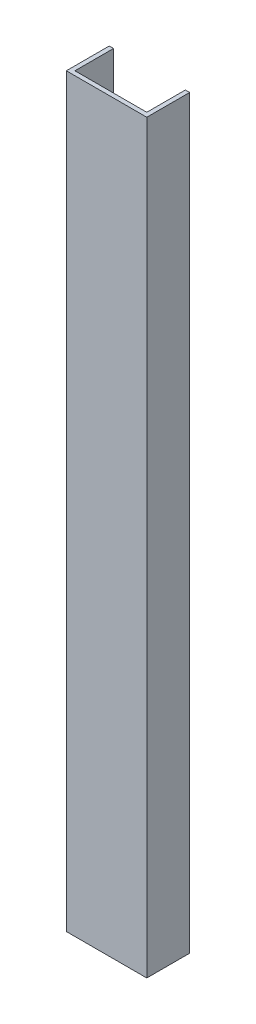
ISO-10303-21;
HEADER;
FILE_DESCRIPTION(('STEP AP214'),'2;1');
FILE_NAME('part.step','',(''),(''),'','','');
FILE_SCHEMA(('AUTOMOTIVE_DESIGN { 1 0 10303 214 1 1 1 1 }'));
ENDSEC;
DATA;
#1=APPLICATION_CONTEXT('core data for automotive mechanical design processes');
#2=APPLICATION_PROTOCOL_DEFINITION('international standard','automotive_design',2000,#1);
#3=PRODUCT_CONTEXT('',#1,'mechanical');
#4=PRODUCT('Part','Part','',(#3));
#5=PRODUCT_RELATED_PRODUCT_CATEGORY('part','',(#4));
#6=PRODUCT_DEFINITION_FORMATION('','',#4);
#7=PRODUCT_DEFINITION_CONTEXT('part definition',#1,'design');
#8=PRODUCT_DEFINITION('design','',#6,#7);
#9=PRODUCT_DEFINITION_SHAPE('','',#8);
#10=(LENGTH_UNIT() NAMED_UNIT(*) SI_UNIT(.MILLI.,.METRE.));
#11=(NAMED_UNIT(*) PLANE_ANGLE_UNIT() SI_UNIT($,.RADIAN.));
#12=(NAMED_UNIT(*) SI_UNIT($,.STERADIAN.) SOLID_ANGLE_UNIT());
#13=UNCERTAINTY_MEASURE_WITH_UNIT(LENGTH_MEASURE(1.E-05),#10,'distance_accuracy_value','');
#14=(GEOMETRIC_REPRESENTATION_CONTEXT(3) GLOBAL_UNCERTAINTY_ASSIGNED_CONTEXT((#13)) GLOBAL_UNIT_ASSIGNED_CONTEXT((#10,
#11,#12)) REPRESENTATION_CONTEXT('',''));
#15=CARTESIAN_POINT('',(0.,0.,0.));
#16=DIRECTION('',(0.,0.,1.));
#17=DIRECTION('',(1.,0.,0.));
#18=AXIS2_PLACEMENT_3D('',#15,#16,#17);
#19=CARTESIAN_POINT('',(0.,0.,0.));
#20=DIRECTION('',(0.,0.,-1.));
#21=DIRECTION('',(-1.,0.,0.));
#22=AXIS2_PLACEMENT_3D('',#19,#20,#21);
#23=PLANE('',#22);
#24=DIRECTION('',(1.,0.,0.));
#25=VECTOR('',#24,1.);
#26=CARTESIAN_POINT('',(0.,0.,0.));
#27=LINE('',#26,#25);
#28=CARTESIAN_POINT('',(3.99999999999992,0.,0.));
#29=VERTEX_POINT('',#28);
#30=CARTESIAN_POINT('',(71.,0.,0.));
#31=VERTEX_POINT('',#30);
#32=EDGE_CURVE('E59',#29,#31,#27,.T.);
#33=ORIENTED_EDGE('',*,*,#32,.F.);
#34=DIRECTION('',(0.,-1.,0.));
#35=VECTOR('',#34,1.);
#36=CARTESIAN_POINT('',(4.,695.,0.));
#37=LINE('',#36,#35);
#38=CARTESIAN_POINT('',(4.,695.,0.));
#39=VERTEX_POINT('',#38);
#40=EDGE_CURVE('E107',#39,#29,#37,.T.);
#41=ORIENTED_EDGE('',*,*,#40,.F.);
#42=DIRECTION('',(-1.,0.,0.));
#43=VECTOR('',#42,1.);
#44=CARTESIAN_POINT('',(0.,695.,0.));
#45=LINE('',#44,#43);
#46=CARTESIAN_POINT('',(71.,695.,0.));
#47=VERTEX_POINT('',#46);
#48=EDGE_CURVE('E114',#47,#39,#45,.T.);
#49=ORIENTED_EDGE('',*,*,#48,.F.);
#50=DIRECTION('',(0.,1.,0.));
#51=VECTOR('',#50,1.);
#52=CARTESIAN_POINT('',(71.,695.,0.));
#53=LINE('',#52,#51);
#54=EDGE_CURVE('E116',#31,#47,#53,.T.);
#55=ORIENTED_EDGE('',*,*,#54,.F.);
#56=EDGE_LOOP('',(#33,#41,#49,#55));
#57=FACE_BOUND('',#56,.T.);
#58=ADVANCED_FACE('F39',(#57),#23,.T.);
#59=CARTESIAN_POINT('',(0.,0.,4.));
#60=DIRECTION('',(1.,0.,0.));
#61=DIRECTION('',(0.,0.,-1.));
#62=AXIS2_PLACEMENT_3D('',#59,#60,#61);
#63=PLANE('',#62);
#64=DIRECTION('',(0.,0.,-1.));
#65=VECTOR('',#64,1.);
#66=CARTESIAN_POINT('',(0.,695.,4.));
#67=LINE('',#66,#65);
#68=CARTESIAN_POINT('',(0.,695.,4.));
#69=VERTEX_POINT('',#68);
#70=CARTESIAN_POINT('',(0.,695.,-36.));
#71=VERTEX_POINT('',#70);
#72=EDGE_CURVE('E133',#69,#71,#67,.T.);
#73=ORIENTED_EDGE('',*,*,#72,.T.);
#74=DIRECTION('',(0.,1.,0.));
#75=VECTOR('',#74,1.);
#76=CARTESIAN_POINT('',(0.,695.,-36.));
#77=LINE('',#76,#75);
#78=CARTESIAN_POINT('',(0.,0.,-36.));
#79=VERTEX_POINT('',#78);
#80=EDGE_CURVE('E117',#79,#71,#77,.T.);
#81=ORIENTED_EDGE('',*,*,#80,.F.);
#82=DIRECTION('',(0.,0.,-1.));
#83=VECTOR('',#82,1.);
#84=CARTESIAN_POINT('',(0.,0.,4.));
#85=LINE('',#84,#83);
#86=CARTESIAN_POINT('',(0.,0.,4.));
#87=VERTEX_POINT('',#86);
#88=EDGE_CURVE('E11',#87,#79,#85,.T.);
#89=ORIENTED_EDGE('',*,*,#88,.F.);
#90=DIRECTION('',(0.,-1.,0.));
#91=VECTOR('',#90,1.);
#92=CARTESIAN_POINT('',(0.,0.,4.));
#93=LINE('',#92,#91);
#94=EDGE_CURVE('E124',#69,#87,#93,.T.);
#95=ORIENTED_EDGE('',*,*,#94,.F.);
#96=EDGE_LOOP('',(#73,#81,#89,#95));
#97=FACE_BOUND('',#96,.T.);
#98=ADVANCED_FACE('F41',(#97),#63,.F.);
#99=CARTESIAN_POINT('',(0.,0.,4.));
#100=DIRECTION('',(0.,1.,0.));
#101=DIRECTION('',(0.,0.,1.));
#102=AXIS2_PLACEMENT_3D('',#99,#100,#101);
#103=PLANE('',#102);
#104=ORIENTED_EDGE('',*,*,#88,.T.);
#105=DIRECTION('',(-1.,0.,0.));
#106=VECTOR('',#105,1.);
#107=CARTESIAN_POINT('',(0.,0.,-36.));
#108=LINE('',#107,#106);
#109=CARTESIAN_POINT('',(3.99999999999992,0.,-36.));
#110=VERTEX_POINT('',#109);
#111=EDGE_CURVE('E178',#110,#79,#108,.T.);
#112=ORIENTED_EDGE('',*,*,#111,.F.);
#113=DIRECTION('',(0.,0.,1.));
#114=VECTOR('',#113,1.);
#115=CARTESIAN_POINT('',(3.99999999999992,0.,-36.));
#116=LINE('',#115,#114);
#117=EDGE_CURVE('E54',#110,#29,#116,.T.);
#118=ORIENTED_EDGE('',*,*,#117,.T.);
#119=ORIENTED_EDGE('',*,*,#32,.T.);
#120=DIRECTION('',(0.,0.,1.));
#121=VECTOR('',#120,1.);
#122=CARTESIAN_POINT('',(70.9999999999999,0.,-36.));
#123=LINE('',#122,#121);
#124=CARTESIAN_POINT('',(70.9999999999999,0.,-36.));
#125=VERTEX_POINT('',#124);
#126=EDGE_CURVE('E129',#125,#31,#123,.T.);
#127=ORIENTED_EDGE('',*,*,#126,.F.);
#128=DIRECTION('',(-1.,0.,0.));
#129=VECTOR('',#128,1.);
#130=CARTESIAN_POINT('',(74.9999999999999,0.,-36.));
#131=LINE('',#130,#129);
#132=CARTESIAN_POINT('',(74.9999999999999,0.,-36.));
#133=VERTEX_POINT('',#132);
#134=EDGE_CURVE('E147',#133,#125,#131,.T.);
#135=ORIENTED_EDGE('',*,*,#134,.F.);
#136=DIRECTION('',(0.,0.,-1.));
#137=VECTOR('',#136,1.);
#138=CARTESIAN_POINT('',(75.,0.,4.));
#139=LINE('',#138,#137);
#140=CARTESIAN_POINT('',(75.,0.,4.));
#141=VERTEX_POINT('',#140);
#142=EDGE_CURVE('E47',#141,#133,#139,.T.);
#143=ORIENTED_EDGE('',*,*,#142,.F.);
#144=DIRECTION('',(1.,0.,0.));
#145=VECTOR('',#144,1.);
#146=CARTESIAN_POINT('',(0.,0.,4.));
#147=LINE('',#146,#145);
#148=EDGE_CURVE('E127',#87,#141,#147,.T.);
#149=ORIENTED_EDGE('',*,*,#148,.F.);
#150=EDGE_LOOP('',(#104,#112,#118,#119,#127,#135,#143,#149));
#151=FACE_BOUND('',#150,.T.);
#152=ADVANCED_FACE('F148',(#151),#103,.F.);
#153=CARTESIAN_POINT('',(75.,0.,4.));
#154=DIRECTION('',(-1.,0.,0.));
#155=DIRECTION('',(0.,0.,1.));
#156=AXIS2_PLACEMENT_3D('',#153,#154,#155);
#157=PLANE('',#156);
#158=ORIENTED_EDGE('',*,*,#142,.T.);
#159=DIRECTION('',(0.,-1.,0.));
#160=VECTOR('',#159,1.);
#161=CARTESIAN_POINT('',(75.,695.,-36.));
#162=LINE('',#161,#160);
#163=CARTESIAN_POINT('',(75.,695.,-36.));
#164=VERTEX_POINT('',#163);
#165=EDGE_CURVE('E145',#164,#133,#162,.T.);
#166=ORIENTED_EDGE('',*,*,#165,.F.);
#167=DIRECTION('',(0.,0.,-1.));
#168=VECTOR('',#167,1.);
#169=CARTESIAN_POINT('',(75.,695.,4.));
#170=LINE('',#169,#168);
#171=CARTESIAN_POINT('',(75.,695.,4.));
#172=VERTEX_POINT('',#171);
#173=EDGE_CURVE('E135',#172,#164,#170,.T.);
#174=ORIENTED_EDGE('',*,*,#173,.F.);
#175=DIRECTION('',(0.,1.,0.));
#176=VECTOR('',#175,1.);
#177=CARTESIAN_POINT('',(75.,0.,4.));
#178=LINE('',#177,#176);
#179=EDGE_CURVE('E146',#141,#172,#178,.T.);
#180=ORIENTED_EDGE('',*,*,#179,.F.);
#181=EDGE_LOOP('',(#158,#166,#174,#180));
#182=FACE_BOUND('',#181,.T.);
#183=ADVANCED_FACE('F142',(#182),#157,.F.);
#184=CARTESIAN_POINT('',(0.,695.,4.));
#185=DIRECTION('',(0.,-1.,0.));
#186=DIRECTION('',(1.,0.,0.));
#187=AXIS2_PLACEMENT_3D('',#184,#185,#186);
#188=PLANE('',#187);
#189=ORIENTED_EDGE('',*,*,#173,.T.);
#190=DIRECTION('',(1.,0.,0.));
#191=VECTOR('',#190,1.);
#192=CARTESIAN_POINT('',(75.,695.,-36.));
#193=LINE('',#192,#191);
#194=CARTESIAN_POINT('',(71.,695.,-36.));
#195=VERTEX_POINT('',#194);
#196=EDGE_CURVE('E156',#195,#164,#193,.T.);
#197=ORIENTED_EDGE('',*,*,#196,.F.);
#198=DIRECTION('',(0.,0.,1.));
#199=VECTOR('',#198,1.);
#200=CARTESIAN_POINT('',(71.,695.,-36.));
#201=LINE('',#200,#199);
#202=EDGE_CURVE('E123',#195,#47,#201,.T.);
#203=ORIENTED_EDGE('',*,*,#202,.T.);
#204=ORIENTED_EDGE('',*,*,#48,.T.);
#205=DIRECTION('',(0.,0.,1.));
#206=VECTOR('',#205,1.);
#207=CARTESIAN_POINT('',(4.,695.,-36.));
#208=LINE('',#207,#206);
#209=CARTESIAN_POINT('',(4.,695.,-36.));
#210=VERTEX_POINT('',#209);
#211=EDGE_CURVE('E104',#210,#39,#208,.T.);
#212=ORIENTED_EDGE('',*,*,#211,.F.);
#213=DIRECTION('',(1.,0.,0.));
#214=VECTOR('',#213,1.);
#215=CARTESIAN_POINT('',(0.,695.,-36.));
#216=LINE('',#215,#214);
#217=EDGE_CURVE('E173',#71,#210,#216,.T.);
#218=ORIENTED_EDGE('',*,*,#217,.F.);
#219=ORIENTED_EDGE('',*,*,#72,.F.);
#220=DIRECTION('',(-1.,0.,0.));
#221=VECTOR('',#220,1.);
#222=CARTESIAN_POINT('',(0.,695.,4.));
#223=LINE('',#222,#221);
#224=EDGE_CURVE('E136',#172,#69,#223,.T.);
#225=ORIENTED_EDGE('',*,*,#224,.F.);
#226=EDGE_LOOP('',(#189,#197,#203,#204,#212,#218,#219,#225));
#227=FACE_BOUND('',#226,.T.);
#228=ADVANCED_FACE('F120',(#227),#188,.F.);
#229=CARTESIAN_POINT('',(0.,0.,4.));
#230=DIRECTION('',(0.,0.,-1.));
#231=DIRECTION('',(-1.,0.,0.));
#232=AXIS2_PLACEMENT_3D('',#229,#230,#231);
#233=PLANE('',#232);
#234=ORIENTED_EDGE('',*,*,#94,.T.);
#235=ORIENTED_EDGE('',*,*,#148,.T.);
#236=ORIENTED_EDGE('',*,*,#179,.T.);
#237=ORIENTED_EDGE('',*,*,#224,.T.);
#238=EDGE_LOOP('',(#234,#235,#236,#237));
#239=FACE_BOUND('',#238,.T.);
#240=ADVANCED_FACE('F170',(#239),#233,.F.);
#241=CARTESIAN_POINT('',(71.,695.,-36.));
#242=DIRECTION('',(1.,0.,0.));
#243=DIRECTION('',(0.,1.,0.));
#244=AXIS2_PLACEMENT_3D('',#241,#242,#243);
#245=PLANE('',#244);
#246=ORIENTED_EDGE('',*,*,#54,.T.);
#247=ORIENTED_EDGE('',*,*,#202,.F.);
#248=DIRECTION('',(0.,1.,0.));
#249=VECTOR('',#248,1.);
#250=CARTESIAN_POINT('',(71.,695.,-36.));
#251=LINE('',#250,#249);
#252=EDGE_CURVE('E152',#125,#195,#251,.T.);
#253=ORIENTED_EDGE('',*,*,#252,.F.);
#254=ORIENTED_EDGE('',*,*,#126,.T.);
#255=EDGE_LOOP('',(#246,#247,#253,#254));
#256=FACE_BOUND('',#255,.T.);
#257=ADVANCED_FACE('F223',(#256),#245,.F.);
#258=CARTESIAN_POINT('',(0.,0.,-36.));
#259=DIRECTION('',(0.,0.,-1.));
#260=DIRECTION('',(-1.,0.,0.));
#261=AXIS2_PLACEMENT_3D('',#258,#259,#260);
#262=PLANE('',#261);
#263=ORIENTED_EDGE('',*,*,#165,.T.);
#264=ORIENTED_EDGE('',*,*,#134,.T.);
#265=ORIENTED_EDGE('',*,*,#252,.T.);
#266=ORIENTED_EDGE('',*,*,#196,.T.);
#267=EDGE_LOOP('',(#263,#264,#265,#266));
#268=FACE_BOUND('',#267,.T.);
#269=ADVANCED_FACE('F155',(#268),#262,.T.);
#270=CARTESIAN_POINT('',(4.,695.,-36.));
#271=DIRECTION('',(-1.,0.,0.));
#272=DIRECTION('',(0.,-1.,0.));
#273=AXIS2_PLACEMENT_3D('',#270,#271,#272);
#274=PLANE('',#273);
#275=ORIENTED_EDGE('',*,*,#40,.T.);
#276=ORIENTED_EDGE('',*,*,#117,.F.);
#277=DIRECTION('',(0.,-1.,0.));
#278=VECTOR('',#277,1.);
#279=CARTESIAN_POINT('',(4.,695.,-36.));
#280=LINE('',#279,#278);
#281=EDGE_CURVE('E108',#210,#110,#280,.T.);
#282=ORIENTED_EDGE('',*,*,#281,.F.);
#283=ORIENTED_EDGE('',*,*,#211,.T.);
#284=EDGE_LOOP('',(#275,#276,#282,#283));
#285=FACE_BOUND('',#284,.T.);
#286=ADVANCED_FACE('F106',(#285),#274,.F.);
#287=CARTESIAN_POINT('',(0.,0.,-36.));
#288=DIRECTION('',(0.,0.,1.));
#289=DIRECTION('',(1.,0.,0.));
#290=AXIS2_PLACEMENT_3D('',#287,#288,#289);
#291=PLANE('',#290);
#292=ORIENTED_EDGE('',*,*,#80,.T.);
#293=ORIENTED_EDGE('',*,*,#217,.T.);
#294=ORIENTED_EDGE('',*,*,#281,.T.);
#295=ORIENTED_EDGE('',*,*,#111,.T.);
#296=EDGE_LOOP('',(#292,#293,#294,#295));
#297=FACE_BOUND('',#296,.T.);
#298=ADVANCED_FACE('F180',(#297),#291,.F.);
#299=CLOSED_SHELL('',(#58,#98,#152,#183,#228,#240,#257,#269,#286,#298));
#300=MANIFOLD_SOLID_BREP('B2',#299);
#301=ADVANCED_BREP_SHAPE_REPRESENTATION('',(#18,#300),#14);
#302=SHAPE_DEFINITION_REPRESENTATION(#9,#301);
ENDSEC;
END-ISO-10303-21;
